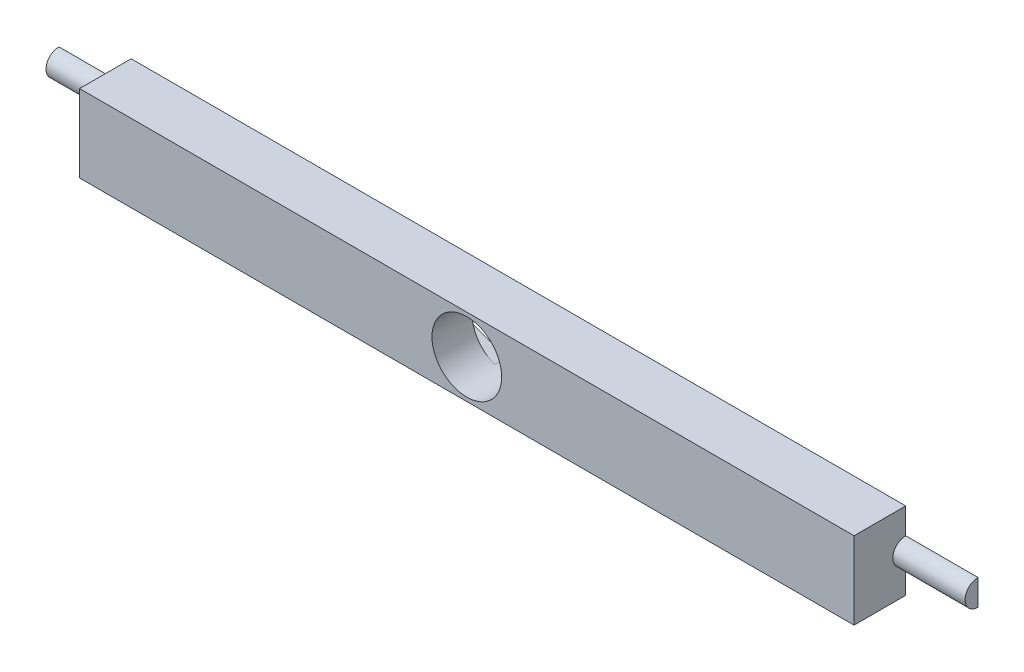
ISO-10303-21;
HEADER;
FILE_DESCRIPTION(('STEP AP214'),'2;1');
FILE_NAME('part.step','',(''),(''),'','','');
FILE_SCHEMA(('AUTOMOTIVE_DESIGN { 1 0 10303 214 1 1 1 1 }'));
ENDSEC;
DATA;
#1=APPLICATION_CONTEXT('core data for automotive mechanical design processes');
#2=APPLICATION_PROTOCOL_DEFINITION('international standard','automotive_design',2000,#1);
#3=PRODUCT_CONTEXT('',#1,'mechanical');
#4=PRODUCT('Part','Part','',(#3));
#5=PRODUCT_RELATED_PRODUCT_CATEGORY('part','',(#4));
#6=PRODUCT_DEFINITION_FORMATION('','',#4);
#7=PRODUCT_DEFINITION_CONTEXT('part definition',#1,'design');
#8=PRODUCT_DEFINITION('design','',#6,#7);
#9=PRODUCT_DEFINITION_SHAPE('','',#8);
#10=(LENGTH_UNIT() NAMED_UNIT(*) SI_UNIT(.MILLI.,.METRE.));
#11=(NAMED_UNIT(*) PLANE_ANGLE_UNIT() SI_UNIT($,.RADIAN.));
#12=(NAMED_UNIT(*) SI_UNIT($,.STERADIAN.) SOLID_ANGLE_UNIT());
#13=UNCERTAINTY_MEASURE_WITH_UNIT(LENGTH_MEASURE(1.E-05),#10,'distance_accuracy_value','');
#14=(GEOMETRIC_REPRESENTATION_CONTEXT(3) GLOBAL_UNCERTAINTY_ASSIGNED_CONTEXT((#13)) GLOBAL_UNIT_ASSIGNED_CONTEXT((#10,
#11,#12)) REPRESENTATION_CONTEXT('',''));
#15=CARTESIAN_POINT('',(0.,0.,0.));
#16=DIRECTION('',(0.,0.,1.));
#17=DIRECTION('',(1.,0.,0.));
#18=AXIS2_PLACEMENT_3D('',#15,#16,#17);
#19=CARTESIAN_POINT('',(0.,0.,0.));
#20=DIRECTION('',(0.,0.,-1.));
#21=DIRECTION('',(-1.,0.,0.));
#22=AXIS2_PLACEMENT_3D('',#19,#20,#21);
#23=PLANE('',#22);
#24=DIRECTION('',(-0.937728734792425,0.347368421052631,0.));
#25=VECTOR('',#24,1.);
#26=CARTESIAN_POINT('',(0.196586565497372,0.530689781133293,0.));
#27=LINE('',#26,#25);
#28=CARTESIAN_POINT('',(-4.68947368421052,2.34066208030227,0.));
#29=VERTEX_POINT('',#28);
#30=CARTESIAN_POINT('',(-25.5736842105263,10.0769241423398,0.));
#31=VERTEX_POINT('',#30);
#32=EDGE_CURVE('E165',#29,#31,#27,.T.);
#33=ORIENTED_EDGE('',*,*,#32,.F.);
#34=CARTESIAN_POINT('',(0.,15.,0.));
#35=DIRECTION('',(0.,0.,-1.));
#36=DIRECTION('',(-1.,0.,0.));
#37=AXIS2_PLACEMENT_3D('',#34,#35,#36);
#38=CIRCLE('',#37,13.5);
#39=CARTESIAN_POINT('',(4.68947368421052,2.34066208030226,0.));
#40=VERTEX_POINT('',#39);
#41=EDGE_CURVE('E195',#40,#29,#38,.T.);
#42=ORIENTED_EDGE('',*,*,#41,.F.);
#43=DIRECTION('',(0.937728734792425,0.347368421052631,0.));
#44=VECTOR('',#43,1.);
#45=CARTESIAN_POINT('',(-0.196586565497371,0.530689781133293,0.));
#46=LINE('',#45,#44);
#47=CARTESIAN_POINT('',(25.5736842105263,10.0769241423398,0.));
#48=VERTEX_POINT('',#47);
#49=EDGE_CURVE('E214',#40,#48,#46,.T.);
#50=ORIENTED_EDGE('',*,*,#49,.T.);
#51=CARTESIAN_POINT('',(23.75,15.,0.));
#52=DIRECTION('',(0.,0.,-1.));
#53=DIRECTION('',(-1.,0.,0.));
#54=AXIS2_PLACEMENT_3D('',#51,#52,#53);
#55=CIRCLE('',#54,5.25);
#56=CARTESIAN_POINT('',(25.5736842105263,19.9230758576602,0.));
#57=VERTEX_POINT('',#56);
#58=EDGE_CURVE('E211',#48,#57,#55,.F.);
#59=ORIENTED_EDGE('',*,*,#58,.T.);
#60=DIRECTION('',(0.937728734792425,-0.347368421052631,0.));
#61=VECTOR('',#60,1.);
#62=CARTESIAN_POINT('',(9.57553393391841,25.8493656205287,0.));
#63=LINE('',#62,#61);
#64=CARTESIAN_POINT('',(4.68947368421052,27.6593379196977,0.));
#65=VERTEX_POINT('',#64);
#66=EDGE_CURVE('E202',#65,#57,#63,.T.);
#67=ORIENTED_EDGE('',*,*,#66,.F.);
#68=CARTESIAN_POINT('',(-4.68947368421052,27.6593379196977,0.));
#69=VERTEX_POINT('',#68);
#70=EDGE_CURVE('E230',#69,#65,#38,.T.);
#71=ORIENTED_EDGE('',*,*,#70,.F.);
#72=DIRECTION('',(-0.937728734792425,-0.347368421052631,0.));
#73=VECTOR('',#72,1.);
#74=CARTESIAN_POINT('',(-9.57553393391842,25.8493656205288,0.));
#75=LINE('',#74,#73);
#76=CARTESIAN_POINT('',(-25.5736842105263,19.9230758576602,0.));
#77=VERTEX_POINT('',#76);
#78=EDGE_CURVE('E179',#69,#77,#75,.T.);
#79=ORIENTED_EDGE('',*,*,#78,.T.);
#80=CARTESIAN_POINT('',(-23.75,15.,0.));
#81=DIRECTION('',(0.,0.,-1.));
#82=DIRECTION('',(-1.,0.,0.));
#83=AXIS2_PLACEMENT_3D('',#80,#81,#82);
#84=CIRCLE('',#83,5.25);
#85=EDGE_CURVE('E182',#31,#77,#84,.T.);
#86=ORIENTED_EDGE('',*,*,#85,.F.);
#87=EDGE_LOOP('',(#33,#42,#50,#59,#67,#71,#79,#86));
#88=FACE_BOUND('',#87,.T.);
#89=DIRECTION('',(0.,-1.,0.));
#90=VECTOR('',#89,1.);
#91=CARTESIAN_POINT('',(150.,30.,0.));
#92=LINE('',#91,#90);
#93=CARTESIAN_POINT('',(150.,30.,0.));
#94=VERTEX_POINT('',#93);
#95=CARTESIAN_POINT('',(150.,20.,0.));
#96=VERTEX_POINT('',#95);
#97=EDGE_CURVE('E263',#94,#96,#92,.T.);
#98=ORIENTED_EDGE('',*,*,#97,.T.);
#99=DIRECTION('',(-1.,0.,0.));
#100=VECTOR('',#99,1.);
#101=CARTESIAN_POINT('',(178.,20.,0.));
#102=LINE('',#101,#100);
#103=CARTESIAN_POINT('',(178.,20.,0.));
#104=VERTEX_POINT('',#103);
#105=EDGE_CURVE('E245',#104,#96,#102,.T.);
#106=ORIENTED_EDGE('',*,*,#105,.F.);
#107=DIRECTION('',(0.,-1.,0.));
#108=VECTOR('',#107,1.);
#109=CARTESIAN_POINT('',(178.,20.,0.));
#110=LINE('',#109,#108);
#111=CARTESIAN_POINT('',(178.,10.,0.));
#112=VERTEX_POINT('',#111);
#113=EDGE_CURVE('E238',#104,#112,#110,.T.);
#114=ORIENTED_EDGE('',*,*,#113,.T.);
#115=DIRECTION('',(-1.,0.,0.));
#116=VECTOR('',#115,1.);
#117=CARTESIAN_POINT('',(178.,10.,0.));
#118=LINE('',#117,#116);
#119=CARTESIAN_POINT('',(150.,10.,0.));
#120=VERTEX_POINT('',#119);
#121=EDGE_CURVE('E250',#112,#120,#118,.T.);
#122=ORIENTED_EDGE('',*,*,#121,.T.);
#123=CARTESIAN_POINT('',(150.,0.,0.));
#124=VERTEX_POINT('',#123);
#125=EDGE_CURVE('E281',#120,#124,#92,.T.);
#126=ORIENTED_EDGE('',*,*,#125,.T.);
#127=DIRECTION('',(-1.,0.,0.));
#128=VECTOR('',#127,1.);
#129=CARTESIAN_POINT('',(150.,0.,0.));
#130=LINE('',#129,#128);
#131=CARTESIAN_POINT('',(-150.,0.,0.));
#132=VERTEX_POINT('',#131);
#133=EDGE_CURVE('E258',#124,#132,#130,.T.);
#134=ORIENTED_EDGE('',*,*,#133,.T.);
#135=DIRECTION('',(0.,1.,0.));
#136=VECTOR('',#135,1.);
#137=CARTESIAN_POINT('',(-150.,0.,0.));
#138=LINE('',#137,#136);
#139=CARTESIAN_POINT('',(-150.,10.,0.));
#140=VERTEX_POINT('',#139);
#141=EDGE_CURVE('E275',#132,#140,#138,.T.);
#142=ORIENTED_EDGE('',*,*,#141,.T.);
#143=CARTESIAN_POINT('',(-178.,10.,0.));
#144=VERTEX_POINT('',#143);
#145=EDGE_CURVE('E244',#140,#144,#118,.T.);
#146=ORIENTED_EDGE('',*,*,#145,.T.);
#147=DIRECTION('',(0.,-1.,0.));
#148=VECTOR('',#147,1.);
#149=CARTESIAN_POINT('',(-178.,20.,0.));
#150=LINE('',#149,#148);
#151=CARTESIAN_POINT('',(-178.,20.,0.));
#152=VERTEX_POINT('',#151);
#153=EDGE_CURVE('E229',#152,#144,#150,.T.);
#154=ORIENTED_EDGE('',*,*,#153,.F.);
#155=CARTESIAN_POINT('',(-150.,20.,0.));
#156=VERTEX_POINT('',#155);
#157=EDGE_CURVE('E249',#156,#152,#102,.T.);
#158=ORIENTED_EDGE('',*,*,#157,.F.);
#159=CARTESIAN_POINT('',(-150.,30.,0.));
#160=VERTEX_POINT('',#159);
#161=EDGE_CURVE('E274',#156,#160,#138,.T.);
#162=ORIENTED_EDGE('',*,*,#161,.T.);
#163=DIRECTION('',(1.,0.,0.));
#164=VECTOR('',#163,1.);
#165=CARTESIAN_POINT('',(-150.,30.,0.));
#166=LINE('',#165,#164);
#167=EDGE_CURVE('E278',#160,#94,#166,.T.);
#168=ORIENTED_EDGE('',*,*,#167,.T.);
#169=EDGE_LOOP('',(#98,#106,#114,#122,#126,#134,#142,#146,#154,#158,#162,#168));
#170=FACE_BOUND('',#169,.T.);
#171=ADVANCED_FACE('F43',(#88,#170),#23,.T.);
#172=CARTESIAN_POINT('',(150.,0.,20.));
#173=DIRECTION('',(0.,-1.,0.));
#174=DIRECTION('',(0.,0.,-1.));
#175=AXIS2_PLACEMENT_3D('',#172,#173,#174);
#176=PLANE('',#175);
#177=ORIENTED_EDGE('',*,*,#133,.F.);
#178=DIRECTION('',(0.,0.,-1.));
#179=VECTOR('',#178,1.);
#180=CARTESIAN_POINT('',(150.,0.,20.));
#181=LINE('',#180,#179);
#182=CARTESIAN_POINT('',(150.,0.,20.));
#183=VERTEX_POINT('',#182);
#184=EDGE_CURVE('E11',#183,#124,#181,.T.);
#185=ORIENTED_EDGE('',*,*,#184,.F.);
#186=DIRECTION('',(-1.,0.,0.));
#187=VECTOR('',#186,1.);
#188=CARTESIAN_POINT('',(150.,0.,20.));
#189=LINE('',#188,#187);
#190=CARTESIAN_POINT('',(-150.,0.,20.));
#191=VERTEX_POINT('',#190);
#192=EDGE_CURVE('E259',#183,#191,#189,.T.);
#193=ORIENTED_EDGE('',*,*,#192,.T.);
#194=DIRECTION('',(0.,0.,-1.));
#195=VECTOR('',#194,1.);
#196=CARTESIAN_POINT('',(-150.,0.,20.));
#197=LINE('',#196,#195);
#198=EDGE_CURVE('E47',#191,#132,#197,.T.);
#199=ORIENTED_EDGE('',*,*,#198,.T.);
#200=EDGE_LOOP('',(#177,#185,#193,#199));
#201=FACE_BOUND('',#200,.T.);
#202=ADVANCED_FACE('F45',(#201),#176,.T.);
#203=CARTESIAN_POINT('',(150.,30.,20.));
#204=DIRECTION('',(1.,0.,0.));
#205=DIRECTION('',(0.,0.,-1.));
#206=AXIS2_PLACEMENT_3D('',#203,#204,#205);
#207=PLANE('',#206);
#208=CARTESIAN_POINT('',(150.,15.,0.));
#209=DIRECTION('',(1.,0.,0.));
#210=DIRECTION('',(0.,0.,-1.));
#211=AXIS2_PLACEMENT_3D('',#208,#209,#210);
#212=CIRCLE('',#211,5.);
#213=EDGE_CURVE('E255',#96,#120,#212,.T.);
#214=ORIENTED_EDGE('',*,*,#213,.F.);
#215=ORIENTED_EDGE('',*,*,#97,.F.);
#216=DIRECTION('',(0.,0.,-1.));
#217=VECTOR('',#216,1.);
#218=CARTESIAN_POINT('',(150.,30.,20.));
#219=LINE('',#218,#217);
#220=CARTESIAN_POINT('',(150.,30.,20.));
#221=VERTEX_POINT('',#220);
#222=EDGE_CURVE('E52',#221,#94,#219,.T.);
#223=ORIENTED_EDGE('',*,*,#222,.F.);
#224=DIRECTION('',(0.,-1.,0.));
#225=VECTOR('',#224,1.);
#226=CARTESIAN_POINT('',(150.,30.,20.));
#227=LINE('',#226,#225);
#228=EDGE_CURVE('E269',#221,#183,#227,.T.);
#229=ORIENTED_EDGE('',*,*,#228,.T.);
#230=ORIENTED_EDGE('',*,*,#184,.T.);
#231=ORIENTED_EDGE('',*,*,#125,.F.);
#232=EDGE_LOOP('',(#214,#215,#223,#229,#230,#231));
#233=FACE_BOUND('',#232,.T.);
#234=ADVANCED_FACE('F297',(#233),#207,.T.);
#235=CARTESIAN_POINT('',(-150.,30.,20.));
#236=DIRECTION('',(0.,1.,0.));
#237=DIRECTION('',(0.,0.,1.));
#238=AXIS2_PLACEMENT_3D('',#235,#236,#237);
#239=PLANE('',#238);
#240=ORIENTED_EDGE('',*,*,#167,.F.);
#241=DIRECTION('',(0.,0.,-1.));
#242=VECTOR('',#241,1.);
#243=CARTESIAN_POINT('',(-150.,30.,20.));
#244=LINE('',#243,#242);
#245=CARTESIAN_POINT('',(-150.,30.,20.));
#246=VERTEX_POINT('',#245);
#247=EDGE_CURVE('E284',#246,#160,#244,.T.);
#248=ORIENTED_EDGE('',*,*,#247,.F.);
#249=DIRECTION('',(1.,0.,0.));
#250=VECTOR('',#249,1.);
#251=CARTESIAN_POINT('',(-150.,30.,20.));
#252=LINE('',#251,#250);
#253=EDGE_CURVE('E266',#246,#221,#252,.T.);
#254=ORIENTED_EDGE('',*,*,#253,.T.);
#255=ORIENTED_EDGE('',*,*,#222,.T.);
#256=EDGE_LOOP('',(#240,#248,#254,#255));
#257=FACE_BOUND('',#256,.T.);
#258=ADVANCED_FACE('F303',(#257),#239,.T.);
#259=CARTESIAN_POINT('',(-150.,0.,20.));
#260=DIRECTION('',(-1.,0.,0.));
#261=DIRECTION('',(0.,0.,1.));
#262=AXIS2_PLACEMENT_3D('',#259,#260,#261);
#263=PLANE('',#262);
#264=CARTESIAN_POINT('',(-150.,15.,0.));
#265=DIRECTION('',(-1.,0.,0.));
#266=DIRECTION('',(0.,0.,1.));
#267=AXIS2_PLACEMENT_3D('',#264,#265,#266);
#268=CIRCLE('',#267,5.);
#269=EDGE_CURVE('E248',#140,#156,#268,.T.);
#270=ORIENTED_EDGE('',*,*,#269,.F.);
#271=ORIENTED_EDGE('',*,*,#141,.F.);
#272=ORIENTED_EDGE('',*,*,#198,.F.);
#273=DIRECTION('',(0.,1.,0.));
#274=VECTOR('',#273,1.);
#275=CARTESIAN_POINT('',(-150.,0.,20.));
#276=LINE('',#275,#274);
#277=EDGE_CURVE('E262',#191,#246,#276,.T.);
#278=ORIENTED_EDGE('',*,*,#277,.T.);
#279=ORIENTED_EDGE('',*,*,#247,.T.);
#280=ORIENTED_EDGE('',*,*,#161,.F.);
#281=EDGE_LOOP('',(#270,#271,#272,#278,#279,#280));
#282=FACE_BOUND('',#281,.T.);
#283=ADVANCED_FACE('F293',(#282),#263,.T.);
#284=CARTESIAN_POINT('',(0.,0.,20.));
#285=DIRECTION('',(0.,0.,-1.));
#286=DIRECTION('',(-1.,0.,0.));
#287=AXIS2_PLACEMENT_3D('',#284,#285,#286);
#288=PLANE('',#287);
#289=CARTESIAN_POINT('',(0.,15.,20.));
#290=DIRECTION('',(0.,0.,-1.));
#291=DIRECTION('',(-1.,0.,0.));
#292=AXIS2_PLACEMENT_3D('',#289,#290,#291);
#293=CIRCLE('',#292,13.5);
#294=CARTESIAN_POINT('',(-13.5,15.,20.));
#295=VERTEX_POINT('',#294);
#296=EDGE_CURVE('E226',#295,#295,#293,.T.);
#297=ORIENTED_EDGE('',*,*,#296,.T.);
#298=EDGE_LOOP('',(#297));
#299=FACE_BOUND('',#298,.T.);
#300=ORIENTED_EDGE('',*,*,#192,.F.);
#301=ORIENTED_EDGE('',*,*,#228,.F.);
#302=ORIENTED_EDGE('',*,*,#253,.F.);
#303=ORIENTED_EDGE('',*,*,#277,.F.);
#304=EDGE_LOOP('',(#300,#301,#302,#303));
#305=FACE_BOUND('',#304,.T.);
#306=ADVANCED_FACE('F300',(#299,#305),#288,.F.);
#307=CARTESIAN_POINT('',(-178.,15.,0.));
#308=DIRECTION('',(-1.,0.,0.));
#309=DIRECTION('',(0.,0.,1.));
#310=AXIS2_PLACEMENT_3D('',#307,#308,#309);
#311=PLANE('',#310);
#312=ORIENTED_EDGE('',*,*,#153,.T.);
#313=CARTESIAN_POINT('',(-178.,15.,0.));
#314=DIRECTION('',(-1.,0.,0.));
#315=DIRECTION('',(0.,0.,1.));
#316=AXIS2_PLACEMENT_3D('',#313,#314,#315);
#317=CIRCLE('',#316,5.);
#318=EDGE_CURVE('E235',#144,#152,#317,.T.);
#319=ORIENTED_EDGE('',*,*,#318,.T.);
#320=EDGE_LOOP('',(#312,#319));
#321=FACE_BOUND('',#320,.T.);
#322=ADVANCED_FACE('F341',(#321),#311,.T.);
#323=CARTESIAN_POINT('',(178.,15.,0.));
#324=DIRECTION('',(-1.,0.,0.));
#325=DIRECTION('',(0.,0.,1.));
#326=AXIS2_PLACEMENT_3D('',#323,#324,#325);
#327=CYLINDRICAL_SURFACE('',#326,5.);
#328=ORIENTED_EDGE('',*,*,#145,.F.);
#329=ORIENTED_EDGE('',*,*,#269,.T.);
#330=ORIENTED_EDGE('',*,*,#157,.T.);
#331=ORIENTED_EDGE('',*,*,#318,.F.);
#332=EDGE_LOOP('',(#328,#329,#330,#331));
#333=FACE_BOUND('',#332,.T.);
#334=ADVANCED_FACE('F323',(#333),#327,.T.);
#335=ORIENTED_EDGE('',*,*,#105,.T.);
#336=ORIENTED_EDGE('',*,*,#213,.T.);
#337=ORIENTED_EDGE('',*,*,#121,.F.);
#338=CARTESIAN_POINT('',(178.,15.,0.));
#339=DIRECTION('',(-1.,0.,0.));
#340=DIRECTION('',(0.,0.,1.));
#341=AXIS2_PLACEMENT_3D('',#338,#339,#340);
#342=CIRCLE('',#341,5.);
#343=EDGE_CURVE('E241',#112,#104,#342,.T.);
#344=ORIENTED_EDGE('',*,*,#343,.T.);
#345=EDGE_LOOP('',(#335,#336,#337,#344));
#346=FACE_BOUND('',#345,.T.);
#347=ADVANCED_FACE('F307',(#346),#327,.T.);
#348=CARTESIAN_POINT('',(178.,15.,0.));
#349=DIRECTION('',(-1.,0.,0.));
#350=DIRECTION('',(0.,0.,1.));
#351=AXIS2_PLACEMENT_3D('',#348,#349,#350);
#352=PLANE('',#351);
#353=ORIENTED_EDGE('',*,*,#113,.F.);
#354=ORIENTED_EDGE('',*,*,#343,.F.);
#355=EDGE_LOOP('',(#353,#354));
#356=FACE_BOUND('',#355,.T.);
#357=ADVANCED_FACE('F311',(#356),#352,.F.);
#358=CARTESIAN_POINT('',(0.,15.,20.));
#359=DIRECTION('',(0.,0.,-1.));
#360=DIRECTION('',(-1.,0.,0.));
#361=AXIS2_PLACEMENT_3D('',#358,#359,#360);
#362=CYLINDRICAL_SURFACE('',#361,13.5);
#363=ORIENTED_EDGE('',*,*,#296,.F.);
#364=EDGE_LOOP('',(#363));
#365=FACE_BOUND('',#364,.T.);
#366=ORIENTED_EDGE('',*,*,#41,.T.);
#367=DIRECTION('',(0.,0.,-1.));
#368=VECTOR('',#367,1.);
#369=CARTESIAN_POINT('',(-4.68947368421052,2.34066208030227,4.5));
#370=LINE('',#369,#368);
#371=CARTESIAN_POINT('',(-4.68947368421052,2.34066208030227,4.5));
#372=VERTEX_POINT('',#371);
#373=EDGE_CURVE('E193',#372,#29,#370,.T.);
#374=ORIENTED_EDGE('',*,*,#373,.F.);
#375=CARTESIAN_POINT('',(0.,15.,4.5));
#376=DIRECTION('',(0.,0.,-1.));
#377=DIRECTION('',(-1.,0.,0.));
#378=AXIS2_PLACEMENT_3D('',#375,#376,#377);
#379=CIRCLE('',#378,13.5);
#380=CARTESIAN_POINT('',(-4.68947368421052,27.6593379196977,4.5));
#381=VERTEX_POINT('',#380);
#382=EDGE_CURVE('E170',#372,#381,#379,.T.);
#383=ORIENTED_EDGE('',*,*,#382,.T.);
#384=DIRECTION('',(0.,0.,-1.));
#385=VECTOR('',#384,1.);
#386=CARTESIAN_POINT('',(-4.68947368421052,27.6593379196977,4.5));
#387=LINE('',#386,#385);
#388=EDGE_CURVE('E196',#381,#69,#387,.T.);
#389=ORIENTED_EDGE('',*,*,#388,.T.);
#390=ORIENTED_EDGE('',*,*,#70,.T.);
#391=DIRECTION('',(0.,0.,-1.));
#392=VECTOR('',#391,1.);
#393=CARTESIAN_POINT('',(4.68947368421052,27.6593379196977,4.5));
#394=LINE('',#393,#392);
#395=CARTESIAN_POINT('',(4.68947368421052,27.6593379196977,4.5));
#396=VERTEX_POINT('',#395);
#397=EDGE_CURVE('E220',#396,#65,#394,.T.);
#398=ORIENTED_EDGE('',*,*,#397,.F.);
#399=CARTESIAN_POINT('',(0.,15.,4.5));
#400=DIRECTION('',(0.,0.,-1.));
#401=DIRECTION('',(-1.,0.,0.));
#402=AXIS2_PLACEMENT_3D('',#399,#400,#401);
#403=CIRCLE('',#402,13.5);
#404=CARTESIAN_POINT('',(4.68947368421052,2.34066208030226,4.5));
#405=VERTEX_POINT('',#404);
#406=EDGE_CURVE('E204',#396,#405,#403,.T.);
#407=ORIENTED_EDGE('',*,*,#406,.T.);
#408=DIRECTION('',(0.,0.,-1.));
#409=VECTOR('',#408,1.);
#410=CARTESIAN_POINT('',(4.68947368421052,2.34066208030226,4.5));
#411=LINE('',#410,#409);
#412=EDGE_CURVE('E222',#405,#40,#411,.T.);
#413=ORIENTED_EDGE('',*,*,#412,.T.);
#414=EDGE_LOOP('',(#366,#374,#383,#389,#390,#398,#407,#413));
#415=FACE_BOUND('',#414,.T.);
#416=ADVANCED_FACE('F313',(#365,#415),#362,.F.);
#417=CARTESIAN_POINT('',(23.75,15.,4.5));
#418=DIRECTION('',(0.,0.,-1.));
#419=DIRECTION('',(-1.,0.,0.));
#420=AXIS2_PLACEMENT_3D('',#417,#418,#419);
#421=CYLINDRICAL_SURFACE('',#420,5.25);
#422=ORIENTED_EDGE('',*,*,#58,.F.);
#423=DIRECTION('',(0.,0.,-1.));
#424=VECTOR('',#423,1.);
#425=CARTESIAN_POINT('',(25.5736842105263,10.0769241423398,4.5));
#426=LINE('',#425,#424);
#427=CARTESIAN_POINT('',(25.5736842105263,10.0769241423398,4.5));
#428=VERTEX_POINT('',#427);
#429=EDGE_CURVE('E210',#428,#48,#426,.T.);
#430=ORIENTED_EDGE('',*,*,#429,.F.);
#431=CARTESIAN_POINT('',(23.75,15.,4.5));
#432=DIRECTION('',(0.,0.,-1.));
#433=DIRECTION('',(-1.,0.,0.));
#434=AXIS2_PLACEMENT_3D('',#431,#432,#433);
#435=CIRCLE('',#434,5.25);
#436=CARTESIAN_POINT('',(25.5736842105263,19.9230758576602,4.5));
#437=VERTEX_POINT('',#436);
#438=EDGE_CURVE('E200',#428,#437,#435,.F.);
#439=ORIENTED_EDGE('',*,*,#438,.T.);
#440=DIRECTION('',(0.,0.,-1.));
#441=VECTOR('',#440,1.);
#442=CARTESIAN_POINT('',(25.5736842105263,19.9230758576602,4.5));
#443=LINE('',#442,#441);
#444=EDGE_CURVE('E191',#437,#57,#443,.T.);
#445=ORIENTED_EDGE('',*,*,#444,.T.);
#446=EDGE_LOOP('',(#422,#430,#439,#445));
#447=FACE_BOUND('',#446,.T.);
#448=ADVANCED_FACE('F320',(#447),#421,.F.);
#449=CARTESIAN_POINT('',(9.57553393391841,25.8493656205287,4.5));
#450=DIRECTION('',(0.347368421052631,0.937728734792425,0.));
#451=DIRECTION('',(-0.937728734792425,0.347368421052631,0.));
#452=AXIS2_PLACEMENT_3D('',#449,#450,#451);
#453=PLANE('',#452);
#454=ORIENTED_EDGE('',*,*,#66,.T.);
#455=ORIENTED_EDGE('',*,*,#444,.F.);
#456=DIRECTION('',(0.937728734792425,-0.347368421052631,0.));
#457=VECTOR('',#456,1.);
#458=CARTESIAN_POINT('',(9.57553393391841,25.8493656205287,4.5));
#459=LINE('',#458,#457);
#460=EDGE_CURVE('E207',#396,#437,#459,.T.);
#461=ORIENTED_EDGE('',*,*,#460,.F.);
#462=ORIENTED_EDGE('',*,*,#397,.T.);
#463=EDGE_LOOP('',(#454,#455,#461,#462));
#464=FACE_BOUND('',#463,.T.);
#465=ADVANCED_FACE('F357',(#464),#453,.F.);
#466=CARTESIAN_POINT('',(-0.196586565497371,0.530689781133293,4.5));
#467=DIRECTION('',(-0.347368421052631,0.937728734792425,0.));
#468=DIRECTION('',(-0.937728734792425,-0.347368421052631,0.));
#469=AXIS2_PLACEMENT_3D('',#466,#467,#468);
#470=PLANE('',#469);
#471=ORIENTED_EDGE('',*,*,#49,.F.);
#472=ORIENTED_EDGE('',*,*,#412,.F.);
#473=DIRECTION('',(0.937728734792425,0.347368421052631,0.));
#474=VECTOR('',#473,1.);
#475=CARTESIAN_POINT('',(-0.196586565497371,0.530689781133293,4.5));
#476=LINE('',#475,#474);
#477=EDGE_CURVE('E68',#405,#428,#476,.T.);
#478=ORIENTED_EDGE('',*,*,#477,.T.);
#479=ORIENTED_EDGE('',*,*,#429,.T.);
#480=EDGE_LOOP('',(#471,#472,#478,#479));
#481=FACE_BOUND('',#480,.T.);
#482=ADVANCED_FACE('F364',(#481),#470,.T.);
#483=CARTESIAN_POINT('',(0.,0.,4.5));
#484=DIRECTION('',(0.,0.,-1.));
#485=DIRECTION('',(-1.,0.,0.));
#486=AXIS2_PLACEMENT_3D('',#483,#484,#485);
#487=PLANE('',#486);
#488=CARTESIAN_POINT('',(23.75,15.,4.5));
#489=DIRECTION('',(0.,0.,-1.));
#490=DIRECTION('',(-1.,0.,0.));
#491=AXIS2_PLACEMENT_3D('',#488,#489,#490);
#492=CIRCLE('',#491,2.4);
#493=CARTESIAN_POINT('',(21.35,15.,4.5));
#494=VERTEX_POINT('',#493);
#495=EDGE_CURVE('E185',#494,#494,#492,.T.);
#496=ORIENTED_EDGE('',*,*,#495,.F.);
#497=EDGE_LOOP('',(#496));
#498=FACE_BOUND('',#497,.T.);
#499=ORIENTED_EDGE('',*,*,#438,.F.);
#500=ORIENTED_EDGE('',*,*,#477,.F.);
#501=ORIENTED_EDGE('',*,*,#406,.F.);
#502=ORIENTED_EDGE('',*,*,#460,.T.);
#503=EDGE_LOOP('',(#499,#500,#501,#502));
#504=FACE_BOUND('',#503,.T.);
#505=ADVANCED_FACE('F362',(#498,#504),#487,.T.);
#506=CARTESIAN_POINT('',(0.196586565497372,0.530689781133293,4.5));
#507=DIRECTION('',(-0.347368421052631,-0.937728734792425,0.));
#508=DIRECTION('',(0.937728734792425,-0.347368421052631,0.));
#509=AXIS2_PLACEMENT_3D('',#506,#507,#508);
#510=PLANE('',#509);
#511=ORIENTED_EDGE('',*,*,#32,.T.);
#512=DIRECTION('',(0.,0.,-1.));
#513=VECTOR('',#512,1.);
#514=CARTESIAN_POINT('',(-25.5736842105263,10.0769241423398,4.5));
#515=LINE('',#514,#513);
#516=CARTESIAN_POINT('',(-25.5736842105263,10.0769241423398,4.5));
#517=VERTEX_POINT('',#516);
#518=EDGE_CURVE('E158',#517,#31,#515,.T.);
#519=ORIENTED_EDGE('',*,*,#518,.F.);
#520=DIRECTION('',(-0.937728734792425,0.347368421052631,0.));
#521=VECTOR('',#520,1.);
#522=CARTESIAN_POINT('',(0.196586565497372,0.530689781133293,4.5));
#523=LINE('',#522,#521);
#524=EDGE_CURVE('E162',#372,#517,#523,.T.);
#525=ORIENTED_EDGE('',*,*,#524,.F.);
#526=ORIENTED_EDGE('',*,*,#373,.T.);
#527=EDGE_LOOP('',(#511,#519,#525,#526));
#528=FACE_BOUND('',#527,.T.);
#529=ADVANCED_FACE('F160',(#528),#510,.F.);
#530=CARTESIAN_POINT('',(-9.57553393391842,25.8493656205288,4.5));
#531=DIRECTION('',(0.347368421052631,-0.937728734792425,0.));
#532=DIRECTION('',(0.937728734792425,0.347368421052631,0.));
#533=AXIS2_PLACEMENT_3D('',#530,#531,#532);
#534=PLANE('',#533);
#535=ORIENTED_EDGE('',*,*,#78,.F.);
#536=ORIENTED_EDGE('',*,*,#388,.F.);
#537=DIRECTION('',(-0.937728734792425,-0.347368421052631,0.));
#538=VECTOR('',#537,1.);
#539=CARTESIAN_POINT('',(-9.57553393391842,25.8493656205288,4.5));
#540=LINE('',#539,#538);
#541=CARTESIAN_POINT('',(-25.5736842105263,19.9230758576602,4.5));
#542=VERTEX_POINT('',#541);
#543=EDGE_CURVE('E60',#381,#542,#540,.T.);
#544=ORIENTED_EDGE('',*,*,#543,.T.);
#545=DIRECTION('',(0.,0.,-1.));
#546=VECTOR('',#545,1.);
#547=CARTESIAN_POINT('',(-25.5736842105263,19.9230758576602,4.5));
#548=LINE('',#547,#546);
#549=EDGE_CURVE('E169',#542,#77,#548,.T.);
#550=ORIENTED_EDGE('',*,*,#549,.T.);
#551=EDGE_LOOP('',(#535,#536,#544,#550));
#552=FACE_BOUND('',#551,.T.);
#553=ADVANCED_FACE('F353',(#552),#534,.T.);
#554=CARTESIAN_POINT('',(-23.75,15.,4.5));
#555=DIRECTION('',(0.,0.,-1.));
#556=DIRECTION('',(-1.,0.,0.));
#557=AXIS2_PLACEMENT_3D('',#554,#555,#556);
#558=CYLINDRICAL_SURFACE('',#557,5.25);
#559=ORIENTED_EDGE('',*,*,#85,.T.);
#560=ORIENTED_EDGE('',*,*,#549,.F.);
#561=CARTESIAN_POINT('',(-23.75,15.,4.5));
#562=DIRECTION('',(0.,0.,-1.));
#563=DIRECTION('',(-1.,0.,0.));
#564=AXIS2_PLACEMENT_3D('',#561,#562,#563);
#565=CIRCLE('',#564,5.25);
#566=EDGE_CURVE('E173',#517,#542,#565,.T.);
#567=ORIENTED_EDGE('',*,*,#566,.F.);
#568=ORIENTED_EDGE('',*,*,#518,.T.);
#569=EDGE_LOOP('',(#559,#560,#567,#568));
#570=FACE_BOUND('',#569,.T.);
#571=ADVANCED_FACE('F174',(#570),#558,.F.);
#572=CARTESIAN_POINT('',(0.,0.,4.5));
#573=DIRECTION('',(0.,0.,-1.));
#574=DIRECTION('',(-1.,0.,0.));
#575=AXIS2_PLACEMENT_3D('',#572,#573,#574);
#576=PLANE('',#575);
#577=ORIENTED_EDGE('',*,*,#524,.T.);
#578=ORIENTED_EDGE('',*,*,#566,.T.);
#579=ORIENTED_EDGE('',*,*,#543,.F.);
#580=ORIENTED_EDGE('',*,*,#382,.F.);
#581=EDGE_LOOP('',(#577,#578,#579,#580));
#582=FACE_BOUND('',#581,.T.);
#583=CARTESIAN_POINT('',(-23.75,15.,4.5));
#584=DIRECTION('',(0.,0.,-1.));
#585=DIRECTION('',(-1.,0.,0.));
#586=AXIS2_PLACEMENT_3D('',#583,#584,#585);
#587=CIRCLE('',#586,2.39999999999999);
#588=CARTESIAN_POINT('',(-26.15,15.,4.5));
#589=VERTEX_POINT('',#588);
#590=EDGE_CURVE('E476',#589,#589,#587,.F.);
#591=ORIENTED_EDGE('',*,*,#590,.T.);
#592=EDGE_LOOP('',(#591));
#593=FACE_BOUND('',#592,.T.);
#594=ADVANCED_FACE('F176',(#582,#593),#576,.T.);
#595=CARTESIAN_POINT('',(-23.75,15.,5.));
#596=DIRECTION('',(0.,0.,-1.));
#597=DIRECTION('',(-1.,0.,0.));
#598=AXIS2_PLACEMENT_3D('',#595,#596,#597);
#599=CYLINDRICAL_SURFACE('',#598,2.39999999999999);
#600=ORIENTED_EDGE('',*,*,#590,.F.);
#601=EDGE_LOOP('',(#600));
#602=FACE_BOUND('',#601,.T.);
#603=CARTESIAN_POINT('',(-23.75,15.,5.));
#604=DIRECTION('',(0.,0.,-1.));
#605=DIRECTION('',(-1.,0.,0.));
#606=AXIS2_PLACEMENT_3D('',#603,#604,#605);
#607=CIRCLE('',#606,2.39999999999999);
#608=CARTESIAN_POINT('',(-26.15,15.,5.));
#609=VERTEX_POINT('',#608);
#610=EDGE_CURVE('E477',#609,#609,#607,.F.);
#611=ORIENTED_EDGE('',*,*,#610,.T.);
#612=EDGE_LOOP('',(#611));
#613=FACE_BOUND('',#612,.T.);
#614=ADVANCED_FACE('F430',(#602,#613),#599,.F.);
#615=CARTESIAN_POINT('',(0.,0.,5.));
#616=DIRECTION('',(0.,0.,-1.));
#617=DIRECTION('',(-1.,0.,0.));
#618=AXIS2_PLACEMENT_3D('',#615,#616,#617);
#619=PLANE('',#618);
#620=ORIENTED_EDGE('',*,*,#610,.F.);
#621=EDGE_LOOP('',(#620));
#622=FACE_BOUND('',#621,.T.);
#623=ADVANCED_FACE('F439',(#622),#619,.T.);
#624=CARTESIAN_POINT('',(23.75,15.,5.));
#625=DIRECTION('',(0.,0.,-1.));
#626=DIRECTION('',(-1.,0.,0.));
#627=AXIS2_PLACEMENT_3D('',#624,#625,#626);
#628=CYLINDRICAL_SURFACE('',#627,2.4);
#629=ORIENTED_EDGE('',*,*,#495,.T.);
#630=EDGE_LOOP('',(#629));
#631=FACE_BOUND('',#630,.T.);
#632=CARTESIAN_POINT('',(23.75,15.,5.));
#633=DIRECTION('',(0.,0.,-1.));
#634=DIRECTION('',(-1.,0.,0.));
#635=AXIS2_PLACEMENT_3D('',#632,#633,#634);
#636=CIRCLE('',#635,2.4);
#637=CARTESIAN_POINT('',(21.35,15.,5.));
#638=VERTEX_POINT('',#637);
#639=EDGE_CURVE('E474',#638,#638,#636,.T.);
#640=ORIENTED_EDGE('',*,*,#639,.F.);
#641=EDGE_LOOP('',(#640));
#642=FACE_BOUND('',#641,.T.);
#643=ADVANCED_FACE('F449',(#631,#642),#628,.F.);
#644=CARTESIAN_POINT('',(0.,0.,5.));
#645=DIRECTION('',(0.,0.,-1.));
#646=DIRECTION('',(-1.,0.,0.));
#647=AXIS2_PLACEMENT_3D('',#644,#645,#646);
#648=PLANE('',#647);
#649=ORIENTED_EDGE('',*,*,#639,.T.);
#650=EDGE_LOOP('',(#649));
#651=FACE_BOUND('',#650,.T.);
#652=ADVANCED_FACE('F459',(#651),#648,.T.);
#653=CLOSED_SHELL('',(#171,#202,#234,#258,#283,#306,#322,#334,#347,#357,#416,#448,#465,#482,
#505,#529,#553,#571,#594,#614,#623,#643,#652));
#654=MANIFOLD_SOLID_BREP('B2',#653);
#655=ADVANCED_BREP_SHAPE_REPRESENTATION('',(#18,#654),#14);
#656=SHAPE_DEFINITION_REPRESENTATION(#9,#655);
ENDSEC;
END-ISO-10303-21;
